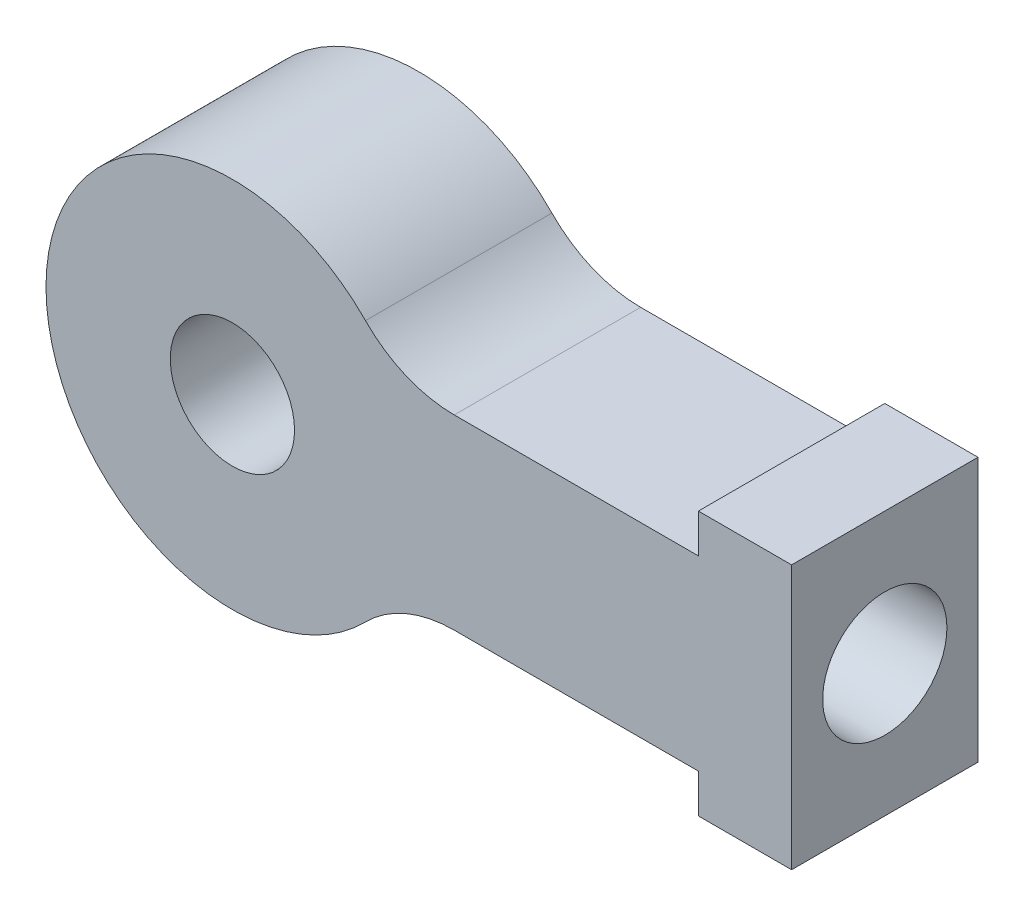
ISO-10303-21;
HEADER;
FILE_DESCRIPTION(('STEP AP214'),'2;1');
FILE_NAME('part.step','',(''),(''),'','','');
FILE_SCHEMA(('AUTOMOTIVE_DESIGN { 1 0 10303 214 1 1 1 1 }'));
ENDSEC;
DATA;
#1=APPLICATION_CONTEXT('core data for automotive mechanical design processes');
#2=APPLICATION_PROTOCOL_DEFINITION('international standard','automotive_design',2000,#1);
#3=PRODUCT_CONTEXT('',#1,'mechanical');
#4=PRODUCT('Part','Part','',(#3));
#5=PRODUCT_RELATED_PRODUCT_CATEGORY('part','',(#4));
#6=PRODUCT_DEFINITION_FORMATION('','',#4);
#7=PRODUCT_DEFINITION_CONTEXT('part definition',#1,'design');
#8=PRODUCT_DEFINITION('design','',#6,#7);
#9=PRODUCT_DEFINITION_SHAPE('','',#8);
#10=(LENGTH_UNIT() NAMED_UNIT(*) SI_UNIT(.MILLI.,.METRE.));
#11=(NAMED_UNIT(*) PLANE_ANGLE_UNIT() SI_UNIT($,.RADIAN.));
#12=(NAMED_UNIT(*) SI_UNIT($,.STERADIAN.) SOLID_ANGLE_UNIT());
#13=UNCERTAINTY_MEASURE_WITH_UNIT(LENGTH_MEASURE(1.E-05),#10,'distance_accuracy_value','');
#14=(GEOMETRIC_REPRESENTATION_CONTEXT(3) GLOBAL_UNCERTAINTY_ASSIGNED_CONTEXT((#13)) GLOBAL_UNIT_ASSIGNED_CONTEXT((#10,
#11,#12)) REPRESENTATION_CONTEXT('',''));
#15=CARTESIAN_POINT('',(0.,0.,0.));
#16=DIRECTION('',(0.,0.,1.));
#17=DIRECTION('',(1.,0.,0.));
#18=AXIS2_PLACEMENT_3D('',#15,#16,#17);
#19=CARTESIAN_POINT('',(14.2828568570827,14.0000000000002,12.));
#20=DIRECTION('',(0.,0.,1.));
#21=DIRECTION('',(1.,0.,0.));
#22=AXIS2_PLACEMENT_3D('',#19,#20,#21);
#23=PLANE('',#22);
#24=CARTESIAN_POINT('',(14.2828568570827,14.0000000000002,12.));
#25=DIRECTION('',(0.,0.,-1.));
#26=DIRECTION('',(1.,0.,0.));
#27=AXIS2_PLACEMENT_3D('',#24,#25,#26);
#28=CIRCLE('',#27,7.9999999999999);
#29=CARTESIAN_POINT('',(14.2828568570827,6.00000000000023,12.));
#30=VERTEX_POINT('',#29);
#31=CARTESIAN_POINT('',(8.56971411424468,8.4000000000044,12.));
#32=VERTEX_POINT('',#31);
#33=EDGE_CURVE('E164',#30,#32,#28,.T.);
#34=ORIENTED_EDGE('',*,*,#33,.T.);
#35=CARTESIAN_POINT('',(0.,0.,12.));
#36=DIRECTION('',(0.,0.,1.));
#37=DIRECTION('',(1.,0.,0.));
#38=AXIS2_PLACEMENT_3D('',#35,#36,#37);
#39=CIRCLE('',#38,11.9999999999983);
#40=CARTESIAN_POINT('',(8.5697141142446,-8.40000000000433,12.));
#41=VERTEX_POINT('',#40);
#42=EDGE_CURVE('E101',#32,#41,#39,.T.);
#43=ORIENTED_EDGE('',*,*,#42,.T.);
#44=CARTESIAN_POINT('',(14.2828568570827,-14.0000000000002,12.));
#45=DIRECTION('',(0.,0.,-1.));
#46=DIRECTION('',(1.,0.,0.));
#47=AXIS2_PLACEMENT_3D('',#44,#45,#46);
#48=CIRCLE('',#47,7.9999999999999);
#49=CARTESIAN_POINT('',(14.2828568570827,-6.00000000000023,12.));
#50=VERTEX_POINT('',#49);
#51=EDGE_CURVE('E185',#41,#50,#48,.T.);
#52=ORIENTED_EDGE('',*,*,#51,.T.);
#53=DIRECTION('',(1.,0.,0.));
#54=VECTOR('',#53,1.);
#55=CARTESIAN_POINT('',(14.2828568570827,-6.00000000000023,12.));
#56=LINE('',#55,#54);
#57=CARTESIAN_POINT('',(29.9999999999976,-6.00000000000023,12.));
#58=VERTEX_POINT('',#57);
#59=EDGE_CURVE('E204',#50,#58,#56,.T.);
#60=ORIENTED_EDGE('',*,*,#59,.T.);
#61=DIRECTION('',(0.,-1.,0.));
#62=VECTOR('',#61,1.);
#63=CARTESIAN_POINT('',(29.9999999999976,-8.49999999999973,12.));
#64=LINE('',#63,#62);
#65=CARTESIAN_POINT('',(29.9999999999976,-8.49999999999973,12.));
#66=VERTEX_POINT('',#65);
#67=EDGE_CURVE('E201',#58,#66,#64,.T.);
#68=ORIENTED_EDGE('',*,*,#67,.T.);
#69=DIRECTION('',(1.,0.,0.));
#70=VECTOR('',#69,1.);
#71=CARTESIAN_POINT('',(29.9999999999976,-8.49999999999973,12.));
#72=LINE('',#71,#70);
#73=CARTESIAN_POINT('',(35.9999999999978,-8.49999999999973,12.));
#74=VERTEX_POINT('',#73);
#75=EDGE_CURVE('E203',#66,#74,#72,.T.);
#76=ORIENTED_EDGE('',*,*,#75,.T.);
#77=DIRECTION('',(0.,1.,0.));
#78=VECTOR('',#77,1.);
#79=CARTESIAN_POINT('',(35.9999999999978,-8.49999999999973,12.));
#80=LINE('',#79,#78);
#81=CARTESIAN_POINT('',(35.9999999999978,8.50000000000017,12.));
#82=VERTEX_POINT('',#81);
#83=EDGE_CURVE('E126',#74,#82,#80,.T.);
#84=ORIENTED_EDGE('',*,*,#83,.T.);
#85=DIRECTION('',(-1.,0.,0.));
#86=VECTOR('',#85,1.);
#87=CARTESIAN_POINT('',(29.9999999999976,8.50000000000017,12.));
#88=LINE('',#87,#86);
#89=CARTESIAN_POINT('',(29.9999999999976,8.50000000000017,12.));
#90=VERTEX_POINT('',#89);
#91=EDGE_CURVE('E120',#82,#90,#88,.T.);
#92=ORIENTED_EDGE('',*,*,#91,.T.);
#93=DIRECTION('',(0.,-1.,0.));
#94=VECTOR('',#93,1.);
#95=CARTESIAN_POINT('',(29.9999999999976,6.00000000000023,12.));
#96=LINE('',#95,#94);
#97=CARTESIAN_POINT('',(29.9999999999976,6.00000000000023,12.));
#98=VERTEX_POINT('',#97);
#99=EDGE_CURVE('E124',#90,#98,#96,.T.);
#100=ORIENTED_EDGE('',*,*,#99,.T.);
#101=DIRECTION('',(-1.,0.,0.));
#102=VECTOR('',#101,1.);
#103=CARTESIAN_POINT('',(14.2828568570827,6.00000000000023,12.));
#104=LINE('',#103,#102);
#105=EDGE_CURVE('E52',#98,#30,#104,.T.);
#106=ORIENTED_EDGE('',*,*,#105,.T.);
#107=EDGE_LOOP('',(#34,#43,#52,#60,#68,#76,#84,#92,#100,#106));
#108=FACE_BOUND('',#107,.T.);
#109=CARTESIAN_POINT('',(0.,0.,12.));
#110=DIRECTION('',(0.,0.,1.));
#111=DIRECTION('',(1.,0.,0.));
#112=AXIS2_PLACEMENT_3D('',#109,#110,#111);
#113=CIRCLE('',#112,4.00000000000134);
#114=CARTESIAN_POINT('',(4.00000000000134,0.,12.));
#115=VERTEX_POINT('',#114);
#116=EDGE_CURVE('E148',#115,#115,#113,.T.);
#117=ORIENTED_EDGE('',*,*,#116,.F.);
#118=EDGE_LOOP('',(#117));
#119=FACE_BOUND('',#118,.T.);
#120=ADVANCED_FACE('F35',(#108,#119),#23,.T.);
#121=CARTESIAN_POINT('',(14.2828568570827,14.0000000000002,0.));
#122=DIRECTION('',(0.,0.,1.));
#123=DIRECTION('',(1.,0.,0.));
#124=AXIS2_PLACEMENT_3D('',#121,#122,#123);
#125=PLANE('',#124);
#126=CARTESIAN_POINT('',(14.2828568570827,14.0000000000002,0.));
#127=DIRECTION('',(0.,0.,-1.));
#128=DIRECTION('',(1.,0.,0.));
#129=AXIS2_PLACEMENT_3D('',#126,#127,#128);
#130=CIRCLE('',#129,7.9999999999999);
#131=CARTESIAN_POINT('',(14.2828568570827,6.00000000000023,0.));
#132=VERTEX_POINT('',#131);
#133=CARTESIAN_POINT('',(8.56971411424468,8.4000000000044,0.));
#134=VERTEX_POINT('',#133);
#135=EDGE_CURVE('E144',#132,#134,#130,.T.);
#136=ORIENTED_EDGE('',*,*,#135,.F.);
#137=DIRECTION('',(-1.,0.,0.));
#138=VECTOR('',#137,1.);
#139=CARTESIAN_POINT('',(14.2828568570827,6.00000000000023,0.));
#140=LINE('',#139,#138);
#141=CARTESIAN_POINT('',(29.9999999999976,6.00000000000023,0.));
#142=VERTEX_POINT('',#141);
#143=EDGE_CURVE('E93',#142,#132,#140,.T.);
#144=ORIENTED_EDGE('',*,*,#143,.F.);
#145=DIRECTION('',(0.,-1.,0.));
#146=VECTOR('',#145,1.);
#147=CARTESIAN_POINT('',(29.9999999999976,6.00000000000023,0.));
#148=LINE('',#147,#146);
#149=CARTESIAN_POINT('',(29.9999999999976,8.50000000000017,0.));
#150=VERTEX_POINT('',#149);
#151=EDGE_CURVE('E87',#150,#142,#148,.T.);
#152=ORIENTED_EDGE('',*,*,#151,.F.);
#153=DIRECTION('',(-1.,0.,0.));
#154=VECTOR('',#153,1.);
#155=CARTESIAN_POINT('',(29.9999999999976,8.50000000000017,0.));
#156=LINE('',#155,#154);
#157=CARTESIAN_POINT('',(35.9999999999978,8.50000000000017,0.));
#158=VERTEX_POINT('',#157);
#159=EDGE_CURVE('E134',#158,#150,#156,.T.);
#160=ORIENTED_EDGE('',*,*,#159,.F.);
#161=DIRECTION('',(0.,1.,0.));
#162=VECTOR('',#161,1.);
#163=CARTESIAN_POINT('',(35.9999999999978,8.50000000000017,0.));
#164=LINE('',#163,#162);
#165=CARTESIAN_POINT('',(35.9999999999978,-8.49999999999973,0.));
#166=VERTEX_POINT('',#165);
#167=EDGE_CURVE('E159',#166,#158,#164,.T.);
#168=ORIENTED_EDGE('',*,*,#167,.F.);
#169=DIRECTION('',(1.,0.,0.));
#170=VECTOR('',#169,1.);
#171=CARTESIAN_POINT('',(29.9999999999976,-8.49999999999973,0.));
#172=LINE('',#171,#170);
#173=CARTESIAN_POINT('',(29.9999999999976,-8.49999999999973,0.));
#174=VERTEX_POINT('',#173);
#175=EDGE_CURVE('E156',#174,#166,#172,.T.);
#176=ORIENTED_EDGE('',*,*,#175,.F.);
#177=DIRECTION('',(0.,-1.,0.));
#178=VECTOR('',#177,1.);
#179=CARTESIAN_POINT('',(29.9999999999976,-8.49999999999973,0.));
#180=LINE('',#179,#178);
#181=CARTESIAN_POINT('',(29.9999999999976,-6.00000000000023,0.));
#182=VERTEX_POINT('',#181);
#183=EDGE_CURVE('E154',#182,#174,#180,.T.);
#184=ORIENTED_EDGE('',*,*,#183,.F.);
#185=DIRECTION('',(1.,0.,0.));
#186=VECTOR('',#185,1.);
#187=CARTESIAN_POINT('',(14.2828568570827,-6.00000000000023,0.));
#188=LINE('',#187,#186);
#189=CARTESIAN_POINT('',(14.2828568570827,-6.00000000000023,0.));
#190=VERTEX_POINT('',#189);
#191=EDGE_CURVE('E152',#190,#182,#188,.T.);
#192=ORIENTED_EDGE('',*,*,#191,.F.);
#193=CARTESIAN_POINT('',(14.2828568570827,-14.0000000000002,0.));
#194=DIRECTION('',(0.,0.,-1.));
#195=DIRECTION('',(1.,0.,0.));
#196=AXIS2_PLACEMENT_3D('',#193,#194,#195);
#197=CIRCLE('',#196,7.9999999999999);
#198=CARTESIAN_POINT('',(8.5697141142446,-8.40000000000433,0.));
#199=VERTEX_POINT('',#198);
#200=EDGE_CURVE('E150',#199,#190,#197,.T.);
#201=ORIENTED_EDGE('',*,*,#200,.F.);
#202=CARTESIAN_POINT('',(0.,0.,0.));
#203=DIRECTION('',(0.,0.,1.));
#204=DIRECTION('',(1.,0.,0.));
#205=AXIS2_PLACEMENT_3D('',#202,#203,#204);
#206=CIRCLE('',#205,11.9999999999983);
#207=EDGE_CURVE('E147',#134,#199,#206,.T.);
#208=ORIENTED_EDGE('',*,*,#207,.F.);
#209=EDGE_LOOP('',(#136,#144,#152,#160,#168,#176,#184,#192,#201,#208));
#210=FACE_BOUND('',#209,.T.);
#211=CARTESIAN_POINT('',(0.,0.,0.));
#212=DIRECTION('',(0.,0.,1.));
#213=DIRECTION('',(1.,0.,0.));
#214=AXIS2_PLACEMENT_3D('',#211,#212,#213);
#215=CIRCLE('',#214,4.00000000000134);
#216=CARTESIAN_POINT('',(4.00000000000134,0.,0.));
#217=VERTEX_POINT('',#216);
#218=EDGE_CURVE('E212',#217,#217,#215,.T.);
#219=ORIENTED_EDGE('',*,*,#218,.T.);
#220=EDGE_LOOP('',(#219));
#221=FACE_BOUND('',#220,.T.);
#222=ADVANCED_FACE('F189',(#210,#221),#125,.F.);
#223=CARTESIAN_POINT('',(14.2828568570827,14.0000000000002,12.));
#224=DIRECTION('',(0.,0.,-1.));
#225=DIRECTION('',(-1.,0.,0.));
#226=AXIS2_PLACEMENT_3D('',#223,#224,#225);
#227=CYLINDRICAL_SURFACE('',#226,7.9999999999999);
#228=ORIENTED_EDGE('',*,*,#135,.T.);
#229=DIRECTION('',(0.,0.,-1.));
#230=VECTOR('',#229,1.);
#231=CARTESIAN_POINT('',(8.56971411424468,8.4000000000044,12.));
#232=LINE('',#231,#230);
#233=EDGE_CURVE('E11',#32,#134,#232,.T.);
#234=ORIENTED_EDGE('',*,*,#233,.F.);
#235=ORIENTED_EDGE('',*,*,#33,.F.);
#236=DIRECTION('',(0.,0.,-1.));
#237=VECTOR('',#236,1.);
#238=CARTESIAN_POINT('',(14.2828568570827,6.00000000000023,12.));
#239=LINE('',#238,#237);
#240=EDGE_CURVE('E140',#30,#132,#239,.T.);
#241=ORIENTED_EDGE('',*,*,#240,.T.);
#242=EDGE_LOOP('',(#228,#234,#235,#241));
#243=FACE_BOUND('',#242,.T.);
#244=ADVANCED_FACE('F37',(#243),#227,.F.);
#245=CARTESIAN_POINT('',(0.,0.,12.));
#246=DIRECTION('',(0.,0.,-1.));
#247=DIRECTION('',(-1.,0.,0.));
#248=AXIS2_PLACEMENT_3D('',#245,#246,#247);
#249=CYLINDRICAL_SURFACE('',#248,11.9999999999983);
#250=ORIENTED_EDGE('',*,*,#207,.T.);
#251=DIRECTION('',(0.,0.,-1.));
#252=VECTOR('',#251,1.);
#253=CARTESIAN_POINT('',(8.5697141142446,-8.40000000000433,12.));
#254=LINE('',#253,#252);
#255=EDGE_CURVE('E44',#41,#199,#254,.T.);
#256=ORIENTED_EDGE('',*,*,#255,.F.);
#257=ORIENTED_EDGE('',*,*,#42,.F.);
#258=ORIENTED_EDGE('',*,*,#233,.T.);
#259=EDGE_LOOP('',(#250,#256,#257,#258));
#260=FACE_BOUND('',#259,.T.);
#261=ADVANCED_FACE('F329',(#260),#249,.T.);
#262=CARTESIAN_POINT('',(14.2828568570827,-14.0000000000002,12.));
#263=DIRECTION('',(0.,0.,-1.));
#264=DIRECTION('',(-1.,0.,0.));
#265=AXIS2_PLACEMENT_3D('',#262,#263,#264);
#266=CYLINDRICAL_SURFACE('',#265,7.9999999999999);
#267=ORIENTED_EDGE('',*,*,#200,.T.);
#268=DIRECTION('',(0.,0.,-1.));
#269=VECTOR('',#268,1.);
#270=CARTESIAN_POINT('',(14.2828568570827,-6.00000000000023,12.));
#271=LINE('',#270,#269);
#272=EDGE_CURVE('E177',#50,#190,#271,.T.);
#273=ORIENTED_EDGE('',*,*,#272,.F.);
#274=ORIENTED_EDGE('',*,*,#51,.F.);
#275=ORIENTED_EDGE('',*,*,#255,.T.);
#276=EDGE_LOOP('',(#267,#273,#274,#275));
#277=FACE_BOUND('',#276,.T.);
#278=ADVANCED_FACE('F183',(#277),#266,.F.);
#279=CARTESIAN_POINT('',(14.2828568570827,-6.00000000000023,12.));
#280=DIRECTION('',(0.,1.,0.));
#281=DIRECTION('',(0.,0.,1.));
#282=AXIS2_PLACEMENT_3D('',#279,#280,#281);
#283=PLANE('',#282);
#284=ORIENTED_EDGE('',*,*,#191,.T.);
#285=DIRECTION('',(0.,0.,-1.));
#286=VECTOR('',#285,1.);
#287=CARTESIAN_POINT('',(29.9999999999976,-6.00000000000023,12.));
#288=LINE('',#287,#286);
#289=EDGE_CURVE('E174',#58,#182,#288,.T.);
#290=ORIENTED_EDGE('',*,*,#289,.F.);
#291=ORIENTED_EDGE('',*,*,#59,.F.);
#292=ORIENTED_EDGE('',*,*,#272,.T.);
#293=EDGE_LOOP('',(#284,#290,#291,#292));
#294=FACE_BOUND('',#293,.T.);
#295=ADVANCED_FACE('F195',(#294),#283,.F.);
#296=CARTESIAN_POINT('',(29.9999999999976,-8.49999999999973,12.));
#297=DIRECTION('',(1.,0.,0.));
#298=DIRECTION('',(0.,0.,-1.));
#299=AXIS2_PLACEMENT_3D('',#296,#297,#298);
#300=PLANE('',#299);
#301=ORIENTED_EDGE('',*,*,#183,.T.);
#302=DIRECTION('',(0.,0.,-1.));
#303=VECTOR('',#302,1.);
#304=CARTESIAN_POINT('',(29.9999999999976,-8.49999999999973,12.));
#305=LINE('',#304,#303);
#306=EDGE_CURVE('E171',#66,#174,#305,.T.);
#307=ORIENTED_EDGE('',*,*,#306,.F.);
#308=ORIENTED_EDGE('',*,*,#67,.F.);
#309=ORIENTED_EDGE('',*,*,#289,.T.);
#310=EDGE_LOOP('',(#301,#307,#308,#309));
#311=FACE_BOUND('',#310,.T.);
#312=ADVANCED_FACE('F199',(#311),#300,.F.);
#313=CARTESIAN_POINT('',(29.9999999999976,-8.49999999999973,12.));
#314=DIRECTION('',(0.,1.,0.));
#315=DIRECTION('',(0.,0.,1.));
#316=AXIS2_PLACEMENT_3D('',#313,#314,#315);
#317=PLANE('',#316);
#318=ORIENTED_EDGE('',*,*,#175,.T.);
#319=DIRECTION('',(0.,0.,-1.));
#320=VECTOR('',#319,1.);
#321=CARTESIAN_POINT('',(35.9999999999978,-8.49999999999973,12.));
#322=LINE('',#321,#320);
#323=EDGE_CURVE('E168',#74,#166,#322,.T.);
#324=ORIENTED_EDGE('',*,*,#323,.F.);
#325=ORIENTED_EDGE('',*,*,#75,.F.);
#326=ORIENTED_EDGE('',*,*,#306,.T.);
#327=EDGE_LOOP('',(#318,#324,#325,#326));
#328=FACE_BOUND('',#327,.T.);
#329=ADVANCED_FACE('F236',(#328),#317,.F.);
#330=CARTESIAN_POINT('',(35.9999999999978,8.50000000000017,12.));
#331=DIRECTION('',(-1.,0.,0.));
#332=DIRECTION('',(0.,0.,1.));
#333=AXIS2_PLACEMENT_3D('',#330,#331,#332);
#334=PLANE('',#333);
#335=CARTESIAN_POINT('',(35.9999999999978,0.,6.));
#336=DIRECTION('',(1.,0.,0.));
#337=DIRECTION('',(0.,0.,-1.));
#338=AXIS2_PLACEMENT_3D('',#335,#336,#337);
#339=CIRCLE('',#338,4.);
#340=CARTESIAN_POINT('',(35.9999999999978,0.,2.));
#341=VERTEX_POINT('',#340);
#342=EDGE_CURVE('E218',#341,#341,#339,.T.);
#343=ORIENTED_EDGE('',*,*,#342,.F.);
#344=EDGE_LOOP('',(#343));
#345=FACE_BOUND('',#344,.T.);
#346=ORIENTED_EDGE('',*,*,#167,.T.);
#347=DIRECTION('',(0.,0.,-1.));
#348=VECTOR('',#347,1.);
#349=CARTESIAN_POINT('',(35.9999999999978,8.50000000000017,12.));
#350=LINE('',#349,#348);
#351=EDGE_CURVE('E135',#82,#158,#350,.T.);
#352=ORIENTED_EDGE('',*,*,#351,.F.);
#353=ORIENTED_EDGE('',*,*,#83,.F.);
#354=ORIENTED_EDGE('',*,*,#323,.T.);
#355=EDGE_LOOP('',(#346,#352,#353,#354));
#356=FACE_BOUND('',#355,.T.);
#357=ADVANCED_FACE('F233',(#345,#356),#334,.F.);
#358=CARTESIAN_POINT('',(29.9999999999976,8.50000000000017,12.));
#359=DIRECTION('',(0.,-1.,0.));
#360=DIRECTION('',(0.,0.,-1.));
#361=AXIS2_PLACEMENT_3D('',#358,#359,#360);
#362=PLANE('',#361);
#363=ORIENTED_EDGE('',*,*,#159,.T.);
#364=DIRECTION('',(0.,0.,-1.));
#365=VECTOR('',#364,1.);
#366=CARTESIAN_POINT('',(29.9999999999976,8.50000000000017,12.));
#367=LINE('',#366,#365);
#368=EDGE_CURVE('E131',#90,#150,#367,.T.);
#369=ORIENTED_EDGE('',*,*,#368,.F.);
#370=ORIENTED_EDGE('',*,*,#91,.F.);
#371=ORIENTED_EDGE('',*,*,#351,.T.);
#372=EDGE_LOOP('',(#363,#369,#370,#371));
#373=FACE_BOUND('',#372,.T.);
#374=ADVANCED_FACE('F132',(#373),#362,.F.);
#375=CARTESIAN_POINT('',(29.9999999999976,6.00000000000023,12.));
#376=DIRECTION('',(1.,0.,0.));
#377=DIRECTION('',(0.,0.,-1.));
#378=AXIS2_PLACEMENT_3D('',#375,#376,#377);
#379=PLANE('',#378);
#380=ORIENTED_EDGE('',*,*,#151,.T.);
#381=DIRECTION('',(0.,0.,-1.));
#382=VECTOR('',#381,1.);
#383=CARTESIAN_POINT('',(29.9999999999976,6.00000000000023,12.));
#384=LINE('',#383,#382);
#385=EDGE_CURVE('E136',#98,#142,#384,.T.);
#386=ORIENTED_EDGE('',*,*,#385,.F.);
#387=ORIENTED_EDGE('',*,*,#99,.F.);
#388=ORIENTED_EDGE('',*,*,#368,.T.);
#389=EDGE_LOOP('',(#380,#386,#387,#388));
#390=FACE_BOUND('',#389,.T.);
#391=ADVANCED_FACE('F138',(#390),#379,.F.);
#392=CARTESIAN_POINT('',(14.2828568570827,6.00000000000023,12.));
#393=DIRECTION('',(0.,-1.,0.));
#394=DIRECTION('',(0.,0.,-1.));
#395=AXIS2_PLACEMENT_3D('',#392,#393,#394);
#396=PLANE('',#395);
#397=ORIENTED_EDGE('',*,*,#143,.T.);
#398=ORIENTED_EDGE('',*,*,#240,.F.);
#399=ORIENTED_EDGE('',*,*,#105,.F.);
#400=ORIENTED_EDGE('',*,*,#385,.T.);
#401=EDGE_LOOP('',(#397,#398,#399,#400));
#402=FACE_BOUND('',#401,.T.);
#403=ADVANCED_FACE('F242',(#402),#396,.F.);
#404=CARTESIAN_POINT('',(0.,0.,12.));
#405=DIRECTION('',(0.,0.,-1.));
#406=DIRECTION('',(-1.,0.,0.));
#407=AXIS2_PLACEMENT_3D('',#404,#405,#406);
#408=CYLINDRICAL_SURFACE('',#407,4.00000000000134);
#409=ORIENTED_EDGE('',*,*,#116,.T.);
#410=EDGE_LOOP('',(#409));
#411=FACE_BOUND('',#410,.T.);
#412=ORIENTED_EDGE('',*,*,#218,.F.);
#413=EDGE_LOOP('',(#412));
#414=FACE_BOUND('',#413,.T.);
#415=ADVANCED_FACE('F229',(#411,#414),#408,.F.);
#416=CARTESIAN_POINT('',(15.9999999999978,0.,6.));
#417=DIRECTION('',(1.,0.,0.));
#418=DIRECTION('',(0.,0.,-1.));
#419=AXIS2_PLACEMENT_3D('',#416,#417,#418);
#420=CYLINDRICAL_SURFACE('',#419,4.);
#421=CARTESIAN_POINT('',(15.9999999999978,0.,6.));
#422=DIRECTION('',(1.,0.,0.));
#423=DIRECTION('',(0.,0.,-1.));
#424=AXIS2_PLACEMENT_3D('',#421,#422,#423);
#425=CIRCLE('',#424,4.);
#426=CARTESIAN_POINT('',(15.9999999999978,0.,2.));
#427=VERTEX_POINT('',#426);
#428=EDGE_CURVE('E215',#427,#427,#425,.T.);
#429=ORIENTED_EDGE('',*,*,#428,.F.);
#430=EDGE_LOOP('',(#429));
#431=FACE_BOUND('',#430,.T.);
#432=ORIENTED_EDGE('',*,*,#342,.T.);
#433=EDGE_LOOP('',(#432));
#434=FACE_BOUND('',#433,.T.);
#435=ADVANCED_FACE('F226',(#431,#434),#420,.F.);
#436=CARTESIAN_POINT('',(15.9999999999978,0.,6.));
#437=DIRECTION('',(1.,0.,0.));
#438=DIRECTION('',(0.,0.,-1.));
#439=AXIS2_PLACEMENT_3D('',#436,#437,#438);
#440=PLANE('',#439);
#441=ORIENTED_EDGE('',*,*,#428,.T.);
#442=EDGE_LOOP('',(#441));
#443=FACE_BOUND('',#442,.T.);
#444=ADVANCED_FACE('F224',(#443),#440,.T.);
#445=CLOSED_SHELL('',(#120,#222,#244,#261,#278,#295,#312,#329,#357,#374,#391,#403,#415,#435,#444));
#446=MANIFOLD_SOLID_BREP('B2',#445);
#447=ADVANCED_BREP_SHAPE_REPRESENTATION('',(#18,#446),#14);
#448=SHAPE_DEFINITION_REPRESENTATION(#9,#447);
ENDSEC;
END-ISO-10303-21;
